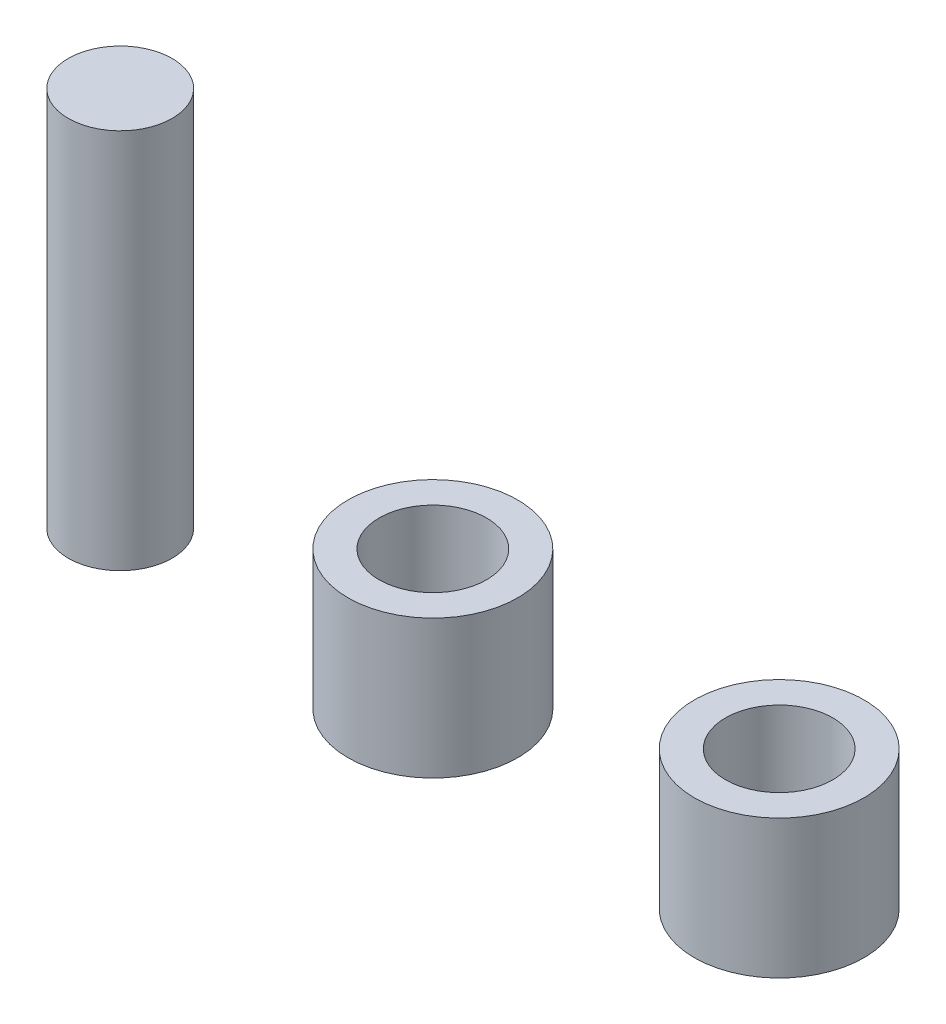
ISO-10303-21;
HEADER;
FILE_DESCRIPTION(('STEP AP214'),'2;1');
FILE_NAME('part.step','',(''),(''),'','','');
FILE_SCHEMA(('AUTOMOTIVE_DESIGN { 1 0 10303 214 1 1 1 1 }'));
ENDSEC;
DATA;
#1=APPLICATION_CONTEXT('core data for automotive mechanical design processes');
#2=APPLICATION_PROTOCOL_DEFINITION('international standard','automotive_design',2000,#1);
#3=PRODUCT_CONTEXT('',#1,'mechanical');
#4=PRODUCT('Part','Part','',(#3));
#5=PRODUCT_RELATED_PRODUCT_CATEGORY('part','',(#4));
#6=PRODUCT_DEFINITION_FORMATION('','',#4);
#7=PRODUCT_DEFINITION_CONTEXT('part definition',#1,'design');
#8=PRODUCT_DEFINITION('design','',#6,#7);
#9=PRODUCT_DEFINITION_SHAPE('','',#8);
#10=(LENGTH_UNIT() NAMED_UNIT(*) SI_UNIT(.MILLI.,.METRE.));
#11=(NAMED_UNIT(*) PLANE_ANGLE_UNIT() SI_UNIT($,.RADIAN.));
#12=(NAMED_UNIT(*) SI_UNIT($,.STERADIAN.) SOLID_ANGLE_UNIT());
#13=UNCERTAINTY_MEASURE_WITH_UNIT(LENGTH_MEASURE(1.E-05),#10,'distance_accuracy_value','');
#14=(GEOMETRIC_REPRESENTATION_CONTEXT(3) GLOBAL_UNCERTAINTY_ASSIGNED_CONTEXT((#13)) GLOBAL_UNIT_ASSIGNED_CONTEXT((#10,
#11,#12)) REPRESENTATION_CONTEXT('',''));
#15=CARTESIAN_POINT('',(0.,0.,0.));
#16=DIRECTION('',(0.,0.,1.));
#17=DIRECTION('',(1.,0.,0.));
#18=AXIS2_PLACEMENT_3D('',#15,#16,#17);
#19=CARTESIAN_POINT('',(10.,4.,0.));
#20=DIRECTION('',(0.,-1.,0.));
#21=DIRECTION('',(0.,0.,-1.));
#22=AXIS2_PLACEMENT_3D('',#19,#20,#21);
#23=CYLINDRICAL_SURFACE('',#22,2.45);
#24=CARTESIAN_POINT('',(10.,4.,0.));
#25=DIRECTION('',(0.,-1.,0.));
#26=DIRECTION('',(0.,0.,1.));
#27=AXIS2_PLACEMENT_3D('',#24,#25,#26);
#28=CIRCLE('',#27,2.45);
#29=CARTESIAN_POINT('',(10.,4.,2.45));
#30=VERTEX_POINT('',#29);
#31=EDGE_CURVE('E11',#30,#30,#28,.T.);
#32=ORIENTED_EDGE('',*,*,#31,.T.);
#33=EDGE_LOOP('',(#32));
#34=FACE_BOUND('',#33,.T.);
#35=CARTESIAN_POINT('',(10.,0.,0.));
#36=DIRECTION('',(0.,-1.,0.));
#37=DIRECTION('',(0.,0.,1.));
#38=AXIS2_PLACEMENT_3D('',#35,#36,#37);
#39=CIRCLE('',#38,2.45);
#40=CARTESIAN_POINT('',(10.,0.,2.45));
#41=VERTEX_POINT('',#40);
#42=EDGE_CURVE('E43',#41,#41,#39,.T.);
#43=ORIENTED_EDGE('',*,*,#42,.F.);
#44=EDGE_LOOP('',(#43));
#45=FACE_BOUND('',#44,.T.);
#46=ADVANCED_FACE('F40',(#34,#45),#23,.T.);
#47=CARTESIAN_POINT('',(10.,4.,0.));
#48=DIRECTION('',(0.,1.,0.));
#49=DIRECTION('',(0.,0.,1.));
#50=AXIS2_PLACEMENT_3D('',#47,#48,#49);
#51=PLANE('',#50);
#52=CARTESIAN_POINT('',(10.,4.,0.));
#53=DIRECTION('',(0.,-1.,0.));
#54=DIRECTION('',(0.,0.,1.));
#55=AXIS2_PLACEMENT_3D('',#52,#53,#54);
#56=CIRCLE('',#55,1.55);
#57=CARTESIAN_POINT('',(10.,4.,1.55));
#58=VERTEX_POINT('',#57);
#59=EDGE_CURVE('E52',#58,#58,#56,.T.);
#60=ORIENTED_EDGE('',*,*,#59,.T.);
#61=EDGE_LOOP('',(#60));
#62=FACE_BOUND('',#61,.T.);
#63=ORIENTED_EDGE('',*,*,#31,.F.);
#64=EDGE_LOOP('',(#63));
#65=FACE_BOUND('',#64,.T.);
#66=ADVANCED_FACE('F70',(#62,#65),#51,.T.);
#67=CARTESIAN_POINT('',(10.,0.,0.));
#68=DIRECTION('',(0.,1.,0.));
#69=DIRECTION('',(0.,0.,1.));
#70=AXIS2_PLACEMENT_3D('',#67,#68,#69);
#71=PLANE('',#70);
#72=ORIENTED_EDGE('',*,*,#42,.T.);
#73=EDGE_LOOP('',(#72));
#74=FACE_BOUND('',#73,.T.);
#75=ADVANCED_FACE('F67',(#74),#71,.F.);
#76=CARTESIAN_POINT('',(10.,1.,0.));
#77=DIRECTION('',(0.,1.,0.));
#78=DIRECTION('',(0.,0.,1.));
#79=AXIS2_PLACEMENT_3D('',#76,#77,#78);
#80=CYLINDRICAL_SURFACE('',#79,1.55);
#81=CARTESIAN_POINT('',(10.,1.,0.));
#82=DIRECTION('',(0.,-1.,0.));
#83=DIRECTION('',(0.,0.,1.));
#84=AXIS2_PLACEMENT_3D('',#81,#82,#83);
#85=CIRCLE('',#84,1.55);
#86=CARTESIAN_POINT('',(10.,1.,1.55));
#87=VERTEX_POINT('',#86);
#88=EDGE_CURVE('E50',#87,#87,#85,.T.);
#89=ORIENTED_EDGE('',*,*,#88,.T.);
#90=EDGE_LOOP('',(#89));
#91=FACE_BOUND('',#90,.T.);
#92=ORIENTED_EDGE('',*,*,#59,.F.);
#93=EDGE_LOOP('',(#92));
#94=FACE_BOUND('',#93,.T.);
#95=ADVANCED_FACE('F58',(#91,#94),#80,.F.);
#96=CARTESIAN_POINT('',(10.,1.,0.));
#97=DIRECTION('',(0.,1.,0.));
#98=DIRECTION('',(0.,0.,1.));
#99=AXIS2_PLACEMENT_3D('',#96,#97,#98);
#100=PLANE('',#99);
#101=ORIENTED_EDGE('',*,*,#88,.F.);
#102=EDGE_LOOP('',(#101));
#103=FACE_BOUND('',#102,.T.);
#104=ADVANCED_FACE('F61',(#103),#100,.T.);
#105=CLOSED_SHELL('',(#46,#66,#75,#95,#104));
#106=MANIFOLD_SOLID_BREP('B2',#105);
#107=CARTESIAN_POINT('',(-9.0272965862901,11.,0.));
#108=DIRECTION('',(0.,-1.,0.));
#109=DIRECTION('',(0.,0.,-1.));
#110=AXIS2_PLACEMENT_3D('',#107,#108,#109);
#111=CYLINDRICAL_SURFACE('',#110,1.5);
#112=CARTESIAN_POINT('',(-9.0272965862901,11.,0.));
#113=DIRECTION('',(0.,1.,0.));
#114=DIRECTION('',(0.,0.,1.));
#115=AXIS2_PLACEMENT_3D('',#112,#113,#114);
#116=CIRCLE('',#115,1.5);
#117=CARTESIAN_POINT('',(-9.0272965862901,11.,1.5));
#118=VERTEX_POINT('',#117);
#119=EDGE_CURVE('E39',#118,#118,#116,.T.);
#120=ORIENTED_EDGE('',*,*,#119,.F.);
#121=EDGE_LOOP('',(#120));
#122=FACE_BOUND('',#121,.T.);
#123=CARTESIAN_POINT('',(-9.0272965862901,0.,0.));
#124=DIRECTION('',(0.,1.,0.));
#125=DIRECTION('',(0.,0.,1.));
#126=AXIS2_PLACEMENT_3D('',#123,#124,#125);
#127=CIRCLE('',#126,1.5);
#128=CARTESIAN_POINT('',(-9.0272965862901,0.,1.5));
#129=VERTEX_POINT('',#128);
#130=EDGE_CURVE('E121',#129,#129,#127,.T.);
#131=ORIENTED_EDGE('',*,*,#130,.T.);
#132=EDGE_LOOP('',(#131));
#133=FACE_BOUND('',#132,.T.);
#134=ADVANCED_FACE('F118',(#122,#133),#111,.T.);
#135=CARTESIAN_POINT('',(-9.0272965862901,11.,0.));
#136=DIRECTION('',(0.,1.,0.));
#137=DIRECTION('',(0.,0.,1.));
#138=AXIS2_PLACEMENT_3D('',#135,#136,#137);
#139=PLANE('',#138);
#140=ORIENTED_EDGE('',*,*,#119,.T.);
#141=EDGE_LOOP('',(#140));
#142=FACE_BOUND('',#141,.T.);
#143=ADVANCED_FACE('F133',(#142),#139,.T.);
#144=CARTESIAN_POINT('',(-9.0272965862901,0.,0.));
#145=DIRECTION('',(0.,1.,0.));
#146=DIRECTION('',(0.,0.,1.));
#147=AXIS2_PLACEMENT_3D('',#144,#145,#146);
#148=PLANE('',#147);
#149=ORIENTED_EDGE('',*,*,#130,.F.);
#150=EDGE_LOOP('',(#149));
#151=FACE_BOUND('',#150,.T.);
#152=ADVANCED_FACE('F131',(#151),#148,.F.);
#153=CLOSED_SHELL('',(#134,#143,#152));
#154=MANIFOLD_SOLID_BREP('B6',#153);
#155=CARTESIAN_POINT('',(0.,4.,0.));
#156=DIRECTION('',(0.,-1.,0.));
#157=DIRECTION('',(0.,0.,-1.));
#158=AXIS2_PLACEMENT_3D('',#155,#156,#157);
#159=CYLINDRICAL_SURFACE('',#158,2.45);
#160=CARTESIAN_POINT('',(0.,4.,0.));
#161=DIRECTION('',(0.,1.,0.));
#162=DIRECTION('',(0.,0.,1.));
#163=AXIS2_PLACEMENT_3D('',#160,#161,#162);
#164=CIRCLE('',#163,2.45);
#165=CARTESIAN_POINT('',(0.,4.,2.45));
#166=VERTEX_POINT('',#165);
#167=EDGE_CURVE('E117',#166,#166,#164,.T.);
#168=ORIENTED_EDGE('',*,*,#167,.F.);
#169=EDGE_LOOP('',(#168));
#170=FACE_BOUND('',#169,.T.);
#171=CARTESIAN_POINT('',(0.,0.,0.));
#172=DIRECTION('',(0.,1.,0.));
#173=DIRECTION('',(0.,0.,1.));
#174=AXIS2_PLACEMENT_3D('',#171,#172,#173);
#175=CIRCLE('',#174,2.45);
#176=CARTESIAN_POINT('',(0.,0.,2.45));
#177=VERTEX_POINT('',#176);
#178=EDGE_CURVE('E162',#177,#177,#175,.T.);
#179=ORIENTED_EDGE('',*,*,#178,.T.);
#180=EDGE_LOOP('',(#179));
#181=FACE_BOUND('',#180,.T.);
#182=ADVANCED_FACE('F159',(#170,#181),#159,.T.);
#183=CARTESIAN_POINT('',(0.,4.,0.));
#184=DIRECTION('',(0.,1.,0.));
#185=DIRECTION('',(0.,0.,1.));
#186=AXIS2_PLACEMENT_3D('',#183,#184,#185);
#187=PLANE('',#186);
#188=CARTESIAN_POINT('',(0.,4.,0.));
#189=DIRECTION('',(0.,1.,0.));
#190=DIRECTION('',(0.,0.,1.));
#191=AXIS2_PLACEMENT_3D('',#188,#189,#190);
#192=CIRCLE('',#191,1.55);
#193=CARTESIAN_POINT('',(0.,4.,1.55));
#194=VERTEX_POINT('',#193);
#195=EDGE_CURVE('E171',#194,#194,#192,.T.);
#196=ORIENTED_EDGE('',*,*,#195,.F.);
#197=EDGE_LOOP('',(#196));
#198=FACE_BOUND('',#197,.T.);
#199=ORIENTED_EDGE('',*,*,#167,.T.);
#200=EDGE_LOOP('',(#199));
#201=FACE_BOUND('',#200,.T.);
#202=ADVANCED_FACE('F186',(#198,#201),#187,.T.);
#203=CARTESIAN_POINT('',(0.,0.,0.));
#204=DIRECTION('',(0.,1.,0.));
#205=DIRECTION('',(0.,0.,1.));
#206=AXIS2_PLACEMENT_3D('',#203,#204,#205);
#207=PLANE('',#206);
#208=ORIENTED_EDGE('',*,*,#178,.F.);
#209=EDGE_LOOP('',(#208));
#210=FACE_BOUND('',#209,.T.);
#211=ADVANCED_FACE('F182',(#210),#207,.F.);
#212=CARTESIAN_POINT('',(0.,1.,0.));
#213=DIRECTION('',(0.,1.,0.));
#214=DIRECTION('',(0.,0.,1.));
#215=AXIS2_PLACEMENT_3D('',#212,#213,#214);
#216=CYLINDRICAL_SURFACE('',#215,1.55);
#217=CARTESIAN_POINT('',(0.,1.,0.));
#218=DIRECTION('',(0.,1.,0.));
#219=DIRECTION('',(0.,0.,1.));
#220=AXIS2_PLACEMENT_3D('',#217,#218,#219);
#221=CIRCLE('',#220,1.55);
#222=CARTESIAN_POINT('',(0.,1.,1.55));
#223=VERTEX_POINT('',#222);
#224=EDGE_CURVE('E169',#223,#223,#221,.T.);
#225=ORIENTED_EDGE('',*,*,#224,.F.);
#226=EDGE_LOOP('',(#225));
#227=FACE_BOUND('',#226,.T.);
#228=ORIENTED_EDGE('',*,*,#195,.T.);
#229=EDGE_LOOP('',(#228));
#230=FACE_BOUND('',#229,.T.);
#231=ADVANCED_FACE('F179',(#227,#230),#216,.F.);
#232=CARTESIAN_POINT('',(0.,1.,0.));
#233=DIRECTION('',(0.,1.,0.));
#234=DIRECTION('',(0.,0.,1.));
#235=AXIS2_PLACEMENT_3D('',#232,#233,#234);
#236=PLANE('',#235);
#237=ORIENTED_EDGE('',*,*,#224,.T.);
#238=EDGE_LOOP('',(#237));
#239=FACE_BOUND('',#238,.T.);
#240=ADVANCED_FACE('F177',(#239),#236,.T.);
#241=CLOSED_SHELL('',(#182,#202,#211,#231,#240));
#242=MANIFOLD_SOLID_BREP('B34',#241);
#243=ADVANCED_BREP_SHAPE_REPRESENTATION('',(#18,#106,#154,#242),#14);
#244=SHAPE_DEFINITION_REPRESENTATION(#9,#243);
ENDSEC;
END-ISO-10303-21;
